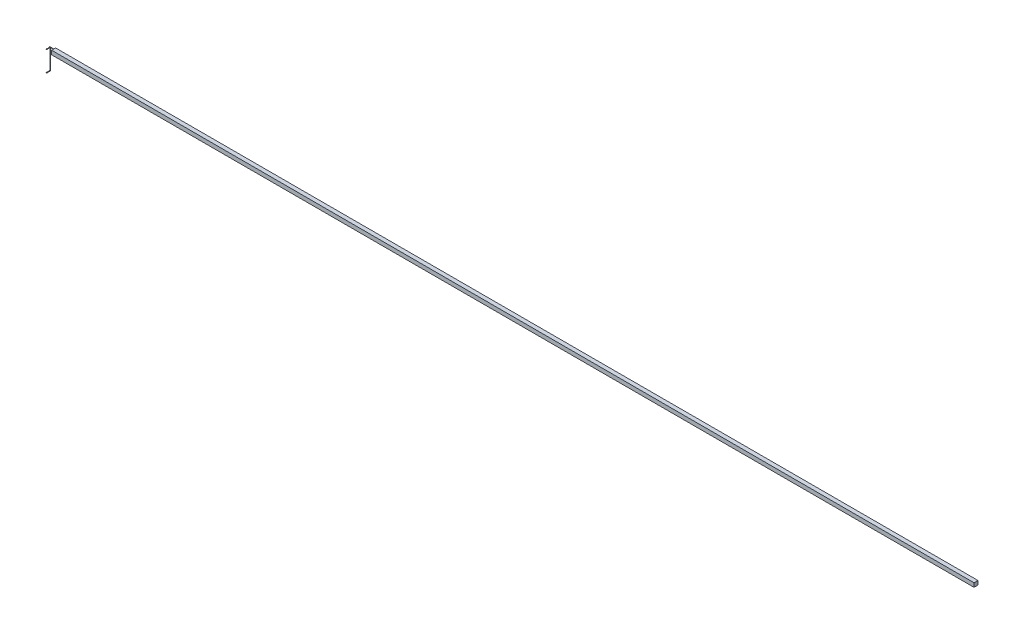
ISO-10303-21;
HEADER;
FILE_DESCRIPTION(('STEP AP214'),'2;1');
FILE_NAME('part.step','',(''),(''),'','','');
FILE_SCHEMA(('AUTOMOTIVE_DESIGN { 1 0 10303 214 1 1 1 1 }'));
ENDSEC;
DATA;
#1=APPLICATION_CONTEXT('core data for automotive mechanical design processes');
#2=APPLICATION_PROTOCOL_DEFINITION('international standard','automotive_design',2000,#1);
#3=PRODUCT_CONTEXT('',#1,'mechanical');
#4=PRODUCT('Part','Part','',(#3));
#5=PRODUCT_RELATED_PRODUCT_CATEGORY('part','',(#4));
#6=PRODUCT_DEFINITION_FORMATION('','',#4);
#7=PRODUCT_DEFINITION_CONTEXT('part definition',#1,'design');
#8=PRODUCT_DEFINITION('design','',#6,#7);
#9=PRODUCT_DEFINITION_SHAPE('','',#8);
#10=(LENGTH_UNIT() NAMED_UNIT(*) SI_UNIT(.MILLI.,.METRE.));
#11=(NAMED_UNIT(*) PLANE_ANGLE_UNIT() SI_UNIT($,.RADIAN.));
#12=(NAMED_UNIT(*) SI_UNIT($,.STERADIAN.) SOLID_ANGLE_UNIT());
#13=UNCERTAINTY_MEASURE_WITH_UNIT(LENGTH_MEASURE(1.E-05),#10,'distance_accuracy_value','');
#14=(GEOMETRIC_REPRESENTATION_CONTEXT(3) GLOBAL_UNCERTAINTY_ASSIGNED_CONTEXT((#13)) GLOBAL_UNIT_ASSIGNED_CONTEXT((#10,
#11,#12)) REPRESENTATION_CONTEXT('',''));
#15=CARTESIAN_POINT('',(0.,0.,0.));
#16=DIRECTION('',(0.,0.,1.));
#17=DIRECTION('',(1.,0.,0.));
#18=AXIS2_PLACEMENT_3D('',#15,#16,#17);
#19=CARTESIAN_POINT('',(112.,86.,0.));
#20=DIRECTION('',(1.,0.,0.));
#21=DIRECTION('',(0.,1.,0.));
#22=AXIS2_PLACEMENT_3D('',#19,#20,#21);
#23=CYLINDRICAL_SURFACE('',#22,1.5);
#24=CARTESIAN_POINT('',(112.,86.,0.));
#25=DIRECTION('',(1.,0.,0.));
#26=DIRECTION('',(0.,0.,-1.));
#27=AXIS2_PLACEMENT_3D('',#24,#25,#26);
#28=CIRCLE('',#27,1.5);
#29=CARTESIAN_POINT('',(112.,87.5,-1.14640854245662E-13));
#30=VERTEX_POINT('',#29);
#31=CARTESIAN_POINT('',(112.,84.5,-1.11022302462516E-13));
#32=VERTEX_POINT('',#31);
#33=EDGE_CURVE('E56',#30,#32,#28,.T.);
#34=ORIENTED_EDGE('',*,*,#33,.F.);
#35=CARTESIAN_POINT('',(112.,86.,0.));
#36=DIRECTION('',(0.707106781186548,0.,0.707106781186548));
#37=DIRECTION('',(-0.707106781186548,0.,0.707106781186548));
#38=AXIS2_PLACEMENT_3D('',#35,#36,#37);
#39=ELLIPSE('',#38,2.12132034355964,1.5);
#40=EDGE_CURVE('E208',#32,#30,#39,.F.);
#41=ORIENTED_EDGE('',*,*,#40,.F.);
#42=EDGE_LOOP('',(#34,#41));
#43=FACE_BOUND('',#42,.T.);
#44=ADVANCED_FACE('F40',(#43),#23,.T.);
#45=CARTESIAN_POINT('',(112.,86.,-15.));
#46=DIRECTION('',(0.,0.,1.));
#47=DIRECTION('',(1.,0.,0.));
#48=AXIS2_PLACEMENT_3D('',#45,#46,#47);
#49=CYLINDRICAL_SURFACE('',#48,1.5);
#50=ORIENTED_EDGE('',*,*,#40,.T.);
#51=DIRECTION('',(0.,0.,1.));
#52=VECTOR('',#51,1.);
#53=CARTESIAN_POINT('',(112.,87.5,-15.));
#54=LINE('',#53,#52);
#55=CARTESIAN_POINT('',(112.,87.5,-15.));
#56=VERTEX_POINT('',#55);
#57=EDGE_CURVE('E152',#30,#56,#54,.F.);
#58=ORIENTED_EDGE('',*,*,#57,.T.);
#59=CARTESIAN_POINT('',(112.,86.,-15.));
#60=DIRECTION('',(0.707106781186548,0.,0.707106781186548));
#61=DIRECTION('',(0.707106781186548,0.,-0.707106781186548));
#62=AXIS2_PLACEMENT_3D('',#59,#60,#61);
#63=ELLIPSE('',#62,2.12132034355964,1.5);
#64=CARTESIAN_POINT('',(112.,84.5,-15.));
#65=VERTEX_POINT('',#64);
#66=EDGE_CURVE('E205',#56,#65,#63,.T.);
#67=ORIENTED_EDGE('',*,*,#66,.T.);
#68=DIRECTION('',(0.,0.,1.));
#69=VECTOR('',#68,1.);
#70=CARTESIAN_POINT('',(112.,84.5,-15.));
#71=LINE('',#70,#69);
#72=EDGE_CURVE('E146',#65,#32,#71,.T.);
#73=ORIENTED_EDGE('',*,*,#72,.T.);
#74=EDGE_LOOP('',(#50,#58,#67,#73));
#75=FACE_BOUND('',#74,.T.);
#76=ADVANCED_FACE('F278',(#75),#49,.T.);
#77=CARTESIAN_POINT('',(71.9999999999997,86.,-19.2426406871193));
#78=DIRECTION('',(0.,0.,1.));
#79=DIRECTION('',(1.,0.,0.));
#80=AXIS2_PLACEMENT_3D('',#77,#78,#79);
#81=CYLINDRICAL_SURFACE('',#80,1.5);
#82=CARTESIAN_POINT('',(71.9999999999998,86.,-11.));
#83=DIRECTION('',(0.,0.,-1.));
#84=DIRECTION('',(-1.,0.,0.));
#85=AXIS2_PLACEMENT_3D('',#82,#83,#84);
#86=CIRCLE('',#85,1.5);
#87=CARTESIAN_POINT('',(70.4999999999998,86.,-11.));
#88=VERTEX_POINT('',#87);
#89=EDGE_CURVE('E48',#88,#88,#86,.F.);
#90=ORIENTED_EDGE('',*,*,#89,.F.);
#91=EDGE_LOOP('',(#90));
#92=FACE_BOUND('',#91,.T.);
#93=CARTESIAN_POINT('',(71.9999999999998,86.,-15.));
#94=DIRECTION('',(0.707106781186545,0.,-0.70710678118655));
#95=DIRECTION('',(0.70710678118655,0.,0.707106781186545));
#96=AXIS2_PLACEMENT_3D('',#93,#94,#95);
#97=ELLIPSE('',#96,2.12132034355965,1.5);
#98=CARTESIAN_POINT('',(72.4354143466934,84.5645856533066,-14.5645856533063));
#99=VERTEX_POINT('',#98);
#100=CARTESIAN_POINT('',(71.9999999999998,87.5,-15.));
#101=VERTEX_POINT('',#100);
#102=EDGE_CURVE('E202',#99,#101,#97,.F.);
#103=ORIENTED_EDGE('',*,*,#102,.T.);
#104=CARTESIAN_POINT('',(71.9999999999998,86.,-15.));
#105=DIRECTION('',(0.70710678118655,0.,0.707106781186545));
#106=DIRECTION('',(-0.707106781186545,0.,0.70710678118655));
#107=AXIS2_PLACEMENT_3D('',#104,#105,#106);
#108=ELLIPSE('',#107,2.12132034355963,1.5);
#109=CARTESIAN_POINT('',(70.5645856533064,85.5645856533063,-13.5645856533066));
#110=VERTEX_POINT('',#109);
#111=EDGE_CURVE('E160',#101,#110,#108,.T.);
#112=ORIENTED_EDGE('',*,*,#111,.T.);
#113=CARTESIAN_POINT('',(71.,84.8819660112499,-13.5));
#114=CARTESIAN_POINT('',(70.9383410889038,84.9371212133062,-13.5000010031375));
#115=CARTESIAN_POINT('',(70.8811841535251,84.997478207983,-13.5038140024479));
#116=CARTESIAN_POINT('',(70.7776460653117,85.1266421729212,-13.515648574613));
#117=CARTESIAN_POINT('',(70.7313051906071,85.1954793138759,-13.5236855270744));
#118=CARTESIAN_POINT('',(70.650747341199,85.3394776110025,-13.5406474353902));
#119=CARTESIAN_POINT('',(70.616485047811,85.4146137901662,-13.5495689074672));
#120=CARTESIAN_POINT('',(70.5607248751387,85.5695829837766,-13.5654672329478));
#121=CARTESIAN_POINT('',(70.5392105500418,85.6494098000981,-13.5724465856319));
#122=CARTESIAN_POINT('',(70.5092698352301,85.8134361743737,-13.5824504520234));
#123=CARTESIAN_POINT('',(70.5011168416737,85.8976915089816,-13.5853921569225));
#124=CARTESIAN_POINT('',(70.4990981303057,86.0663949026319,-13.5861047234806));
#125=CARTESIAN_POINT('',(70.5052315057026,86.1508429491025,-13.5838759133251));
#126=CARTESIAN_POINT('',(70.5308226599426,86.3128850658783,-13.5752069654098));
#127=CARTESIAN_POINT('',(70.5495662860445,86.3906065368669,-13.5689933387882));
#128=CARTESIAN_POINT('',(70.599059330029,86.5419513059894,-13.5543485907704));
#129=CARTESIAN_POINT('',(70.6298181513377,86.615571342536,-13.545915734234));
#130=CARTESIAN_POINT('',(70.7043446613673,86.7604107128016,-13.5289066956695));
#131=CARTESIAN_POINT('',(70.7486610458415,86.8313497457067,-13.5203427436727));
#132=CARTESIAN_POINT('',(70.8486670102947,86.9650821517957,-13.5068041942516));
#133=CARTESIAN_POINT('',(70.9043457039975,87.0278832285202,-13.5018261816513));
#134=CARTESIAN_POINT('',(71.0144463700531,87.1328586918955,-13.4992525798438));
#135=CARTESIAN_POINT('',(71.067243344068,87.1767057929829,-13.5004755260551));
#136=CARTESIAN_POINT('',(71.1779596089969,87.2565404636491,-13.5095620104553));
#137=CARTESIAN_POINT('',(71.235874061114,87.2925353484348,-13.517419334456));
#138=CARTESIAN_POINT('',(71.3550517981144,87.3559567046491,-13.5413552989704));
#139=CARTESIAN_POINT('',(71.4163304724144,87.383339133724,-13.5574751235682));
#140=CARTESIAN_POINT('',(71.5392323210998,87.4289821355658,-13.5987773930534));
#141=CARTESIAN_POINT('',(71.6008554503456,87.4472438764856,-13.6239586766624));
#142=CARTESIAN_POINT('',(71.7166127723875,87.4740871540733,-13.6808034430698));
#143=CARTESIAN_POINT('',(71.7709441722622,87.4833459852188,-13.7117560023681));
#144=CARTESIAN_POINT('',(71.8757611730101,87.4957785324113,-13.7805834330096));
#145=CARTESIAN_POINT('',(71.9262457821064,87.4989506842585,-13.8184600810181));
#146=CARTESIAN_POINT('',(72.0253017678294,87.5006598352292,-13.9030578573165));
#147=CARTESIAN_POINT('',(72.073513886985,87.4988694540297,-13.9502034526277));
#148=CARTESIAN_POINT('',(72.1630749730936,87.4917869482593,-14.0503790619474));
#149=CARTESIAN_POINT('',(72.204419481519,87.4864925598779,-14.1034128616618));
#150=CARTESIAN_POINT('',(72.2857794362514,87.4731941334151,-14.2235567593647));
#151=CARTESIAN_POINT('',(72.3244514268979,87.4648872357454,-14.2915459312266));
#152=CARTESIAN_POINT('',(72.3907984026608,87.4486016845141,-14.4327509812479));
#153=CARTESIAN_POINT('',(72.4184686219756,87.4406231745438,-14.505969108347));
#154=CARTESIAN_POINT('',(72.4639761522302,87.4266571918031,-14.662433493599));
#155=CARTESIAN_POINT('',(72.4807843543017,87.4208950811791,-14.7460042269243));
#156=CARTESIAN_POINT('',(72.4999954650478,87.4142541103406,-14.9149505320181));
#157=CARTESIAN_POINT('',(72.5024064970357,87.4133724964246,-15.0003250587362));
#158=CARTESIAN_POINT('',(72.4929959936689,87.4166760478644,-15.1657546504519));
#159=CARTESIAN_POINT('',(72.4818993729566,87.4206032058387,-15.2458576462784));
#160=CARTESIAN_POINT('',(72.4470839291205,87.4319377700111,-15.4030312670351));
#161=CARTESIAN_POINT('',(72.4233586279893,87.4393469621246,-15.4801003138613));
#162=CARTESIAN_POINT('',(72.3634909285778,87.4556258968165,-15.6305172101941));
#163=CARTESIAN_POINT('',(72.3271564707951,87.4645170547281,-15.7037860774781));
#164=CARTESIAN_POINT('',(72.2429616720443,87.48081234953,-15.8436287770997));
#165=CARTESIAN_POINT('',(72.1950953244377,87.4882157077689,-15.9101990946479));
#166=CARTESIAN_POINT('',(72.087134449031,87.4984796701023,-16.0369614228631));
#167=CARTESIAN_POINT('',(72.0266886869898,87.5011823949405,-16.0968706553187));
#168=CARTESIAN_POINT('',(71.8966628340116,87.4978382975488,-16.2054583944521));
#169=CARTESIAN_POINT('',(71.8271001768709,87.4918079593669,-16.2541578591277));
#170=CARTESIAN_POINT('',(71.6923120249501,87.4694651172681,-16.3326388883716));
#171=CARTESIAN_POINT('',(71.627815337126,87.4546884696547,-16.3641046405804));
#172=CARTESIAN_POINT('',(71.4977444458945,87.4150422369939,-16.416743285502));
#173=CARTESIAN_POINT('',(71.432171014179,87.3901796014266,-16.437923243333));
#174=CARTESIAN_POINT('',(71.3118237572993,87.3342531992104,-16.4683704665197));
#175=CARTESIAN_POINT('',(71.256763387827,87.3044342028141,-16.478837698358));
#176=CARTESIAN_POINT('',(71.150246324653,87.2376873411175,-16.4934245876954));
#177=CARTESIAN_POINT('',(71.0987904007257,87.2007579635809,-16.4975428932233));
#178=CARTESIAN_POINT('',(70.9983624446923,87.118548768478,-16.5008847258836));
#179=CARTESIAN_POINT('',(70.9496563173164,87.0729359694929,-16.4998442182621));
#180=CARTESIAN_POINT('',(70.8588290155896,86.975786430515,-16.4940365638437));
#181=CARTESIAN_POINT('',(70.8167117056983,86.9242462445213,-16.4892672397905));
#182=CARTESIAN_POINT('',(70.7334730565352,86.8073777169641,-16.4768256949438));
#183=CARTESIAN_POINT('',(70.6936334483112,86.7411713536181,-16.4688069840092));
#184=CARTESIAN_POINT('',(70.6245634301353,86.6034222742462,-16.4526899801451));
#185=CARTESIAN_POINT('',(70.5953389237884,86.5318766153429,-16.444591645496));
#186=CARTESIAN_POINT('',(70.5458699472752,86.3777213188603,-16.4298623020312));
#187=CARTESIAN_POINT('',(70.5267818108788,86.2947136601547,-16.4234519576831));
#188=CARTESIAN_POINT('',(70.5029308346639,86.1264668714831,-16.4153052422479));
#189=CARTESIAN_POINT('',(70.4981593099499,86.0412291260293,-16.4135660375715));
#190=CARTESIAN_POINT('',(70.5030011899521,85.8752411589582,-16.4152712221427));
#191=CARTESIAN_POINT('',(70.5119500540225,85.7944680587167,-16.4184761884631));
#192=CARTESIAN_POINT('',(70.5426774532579,85.6356364385152,-16.428675167719));
#193=CARTESIAN_POINT('',(70.5644618613842,85.557579178526,-16.4356709150258));
#194=CARTESIAN_POINT('',(70.6203635181689,85.4056990037749,-16.4514540039866));
#195=CARTESIAN_POINT('',(70.6545528246377,85.3319038111812,-16.4602516799365));
#196=CARTESIAN_POINT('',(70.7344729409976,85.1906614019791,-16.4768745483547));
#197=CARTESIAN_POINT('',(70.780210703168,85.1232180429347,-16.4846991507734));
#198=CARTESIAN_POINT('',(70.8844168586877,84.9936869291277,-16.4964968959187));
#199=CARTESIAN_POINT('',(70.9433417352825,84.9319461621084,-16.5002932152933));
#200=CARTESIAN_POINT('',(71.0708064608412,84.8194114203037,-16.4996734366918));
#201=CARTESIAN_POINT('',(71.1393295392379,84.7685987357409,-16.4952715016906));
#202=CARTESIAN_POINT('',(71.2736715546201,84.6855130603464,-16.4761784861714));
#203=CARTESIAN_POINT('',(71.3387326240586,84.6517065919831,-16.4628620844001));
#204=CARTESIAN_POINT('',(71.470543486476,84.594718161136,-16.4259217790645));
#205=CARTESIAN_POINT('',(71.5372917278801,84.5715267867393,-16.4023070429836));
#206=CARTESIAN_POINT('',(71.6595429460312,84.5379692044558,-16.3486357531833));
#207=CARTESIAN_POINT('',(71.7152974608192,84.5262499575326,-16.3199690439503));
#208=CARTESIAN_POINT('',(71.8234612870885,84.5094193404156,-16.2553409404403));
#209=CARTESIAN_POINT('',(71.8758698707595,84.5043094032616,-16.2193779661316));
#210=CARTESIAN_POINT('',(71.9776481975815,84.499268270207,-16.1395362855101));
#211=CARTESIAN_POINT('',(72.0268365808861,84.4995334078662,-16.0954160888148));
#212=CARTESIAN_POINT('',(72.1188970802296,84.5040083987028,-16.0012066866406));
#213=CARTESIAN_POINT('',(72.1617659009298,84.5082203015609,-15.9511143914591));
#214=CARTESIAN_POINT('',(72.2467669744442,84.5197194832883,-15.8374825715459));
#215=CARTESIAN_POINT('',(72.2876863691432,84.5273907063706,-15.7730734191156));
#216=CARTESIAN_POINT('',(72.3593000225837,84.5432051533681,-15.6388270912977));
#217=CARTESIAN_POINT('',(72.3899875209673,84.55134868519,-15.5689863646197));
#218=CARTESIAN_POINT('',(72.4432496427007,84.5666856335679,-15.4173379233886));
#219=CARTESIAN_POINT('',(72.4645598577671,84.5736758765142,-15.3350590670086));
#220=CARTESIAN_POINT('',(72.4929850475938,84.5832434451466,-15.1678605504071));
#221=CARTESIAN_POINT('',(72.5001088352628,84.5858235103872,-15.0829425629937));
#222=CARTESIAN_POINT('',(72.4998930871178,84.5857499873309,-14.9165942851122));
#223=CARTESIAN_POINT('',(72.4931300559449,84.5833050074606,-14.8351626243685));
#224=CARTESIAN_POINT('',(72.4665568331731,84.5743366283166,-14.674680745163));
#225=CARTESIAN_POINT('',(72.4467415381334,84.5678116338061,-14.5956314708634));
#226=CARTESIAN_POINT('',(72.3948121915711,84.5526419800362,-14.4423017533853));
#227=CARTESIAN_POINT('',(72.3627505375555,84.5440064070618,-14.3680025461527));
#228=CARTESIAN_POINT('',(72.2870674272177,84.5272162698577,-14.2254183565377));
#229=CARTESIAN_POINT('',(72.2434382488335,84.5190620314119,-14.1571374324665));
#230=CARTESIAN_POINT('',(72.1430926931499,84.5059422245843,-14.0250381328922));
#231=CARTESIAN_POINT('',(72.0858341465423,84.5011550479926,-13.9616095682004));
#232=CARTESIAN_POINT('',(71.9612862773896,84.4992150190652,-13.8453792454775));
#233=CARTESIAN_POINT('',(71.894013103837,84.5020499989996,-13.7925606947282));
#234=CARTESIAN_POINT('',(71.7604825760813,84.5179007151504,-13.7048933458791));
#235=CARTESIAN_POINT('',(71.6949835922201,84.5297190837114,-13.6686824707334));
#236=CARTESIAN_POINT('',(71.5616228712863,84.56384562845,-13.6071772579927));
#237=CARTESIAN_POINT('',(71.4937629323676,84.5861459765455,-13.5818748008356));
#238=CARTESIAN_POINT('',(71.3695815533226,84.6375025013965,-13.5450188550212));
#239=CARTESIAN_POINT('',(71.3130597760273,84.6650380876527,-13.5319698322898));
#240=CARTESIAN_POINT('',(71.2031499912196,84.7275941652268,-13.5127759484575));
#241=CARTESIAN_POINT('',(71.1497581321464,84.7626052001701,-13.5066224254945));
#242=CARTESIAN_POINT('',(71.0817538002579,84.8137113942566,-13.5021316870085));
#243=CARTESIAN_POINT('',(71.0650009446656,84.8268713930941,-13.5013182946988));
#244=CARTESIAN_POINT('',(71.0320659770885,84.853894746377,-13.5002524475348));
#245=CARTESIAN_POINT('',(71.0158836128162,84.8677577831335,-13.4999997415873));
#246=CARTESIAN_POINT('',(71.,84.8819660112499,-13.5));
#247=B_SPLINE_CURVE_WITH_KNOTS('',3,(#113,#114,#115,#116,#117,#118,#119,#120,#121,#122,#123,
#124,#125,#126,#127,#128,#129,#130,#131,#132,#133,#134,#135,#136,#137,#138,#139,#140,#141,#142,
#143,#144,#145,#146,#147,#148,#149,#150,#151,#152,#153,#154,#155,#156,#157,#158,#159,#160,#161,
#162,#163,#164,#165,#166,#167,#168,#169,#170,#171,#172,#173,#174,#175,#176,#177,#178,#179,#180,
#181,#182,#183,#184,#185,#186,#187,#188,#189,#190,#191,#192,#193,#194,#195,#196,#197,#198,#199,
#200,#201,#202,#203,#204,#205,#206,#207,#208,#209,#210,#211,#212,#213,#214,#215,#216,#217,#218,
#219,#220,#221,#222,#223,#224,#225,#226,#227,#228,#229,#230,#231,#232,#233,#234,#235,#236,#237,
#238,#239,#240,#241,#242,#243,#244,#245,#246),.UNSPECIFIED.,.T.,.F.,(4,2,2,2,2,2,2,2,2,2,2,2,2,
2,2,2,2,2,2,2,2,2,2,2,2,2,2,2,2,2,2,2,2,2,2,2,2,2,2,2,2,2,2,2,2,2,2,2,2,2,2,2,2,2,2,2,2,2,2,2,2,
2,2,2,2,2,4),(0.,0.248098250340316,0.497106160671044,0.745169596037857,0.992912310697383,
1.24566370871284,1.49839906440563,1.73790713407445,1.97760302619075,2.2286886115958,
2.47953475087677,2.68460276580055,2.8894789135345,3.09538633458765,3.30126737680863,
3.49007135611712,3.6789238491729,3.88052591438121,4.08225835459034,4.31725718907559,
4.5523577108983,4.80733485264303,5.06216811506528,5.30390785811879,5.54577172364808,
5.79149420103044,6.03734494614643,6.29130417804693,6.54478467485286,6.76324082556417,
6.98154670988197,7.17115581364624,7.36080528812357,7.56025846178646,7.75982818323263,
7.99193282421743,8.22416635361335,8.47908953904213,8.73385804895331,8.97667091555345,
9.21959496864977,9.4639533271064,9.70845914381084,9.96330247084802,10.2177059491203,
10.4398680249474,10.6618327365311,10.8522963755807,11.0428013043073,11.2402768800805,
11.4378550680718,11.667012471819,11.8963209844341,12.1508638194392,12.4052484776623,
12.6492861324566,12.8934192627648,13.1365193336601,13.3797820997941,13.6351212271417,
13.8900529826357,14.1159244478103,14.341627496524,14.5333835255241,14.7248984069939,
14.7888382722178,14.8527494973551),.UNSPECIFIED.);
#248=EDGE_CURVE('E12',#99,#110,#247,.T.);
#249=ORIENTED_EDGE('',*,*,#248,.F.);
#250=EDGE_LOOP('',(#103,#112,#249));
#251=FACE_BOUND('',#250,.T.);
#252=ADVANCED_FACE('F237',(#92,#251),#81,.T.);
#253=CARTESIAN_POINT('',(71.,-68.,-15.));
#254=DIRECTION('',(0.,1.,0.));
#255=DIRECTION('',(0.,0.,1.));
#256=AXIS2_PLACEMENT_3D('',#253,#254,#255);
#257=CYLINDRICAL_SURFACE('',#256,1.5);
#258=CARTESIAN_POINT('',(71.,-68.,-15.));
#259=DIRECTION('',(0.,0.707106781186548,-0.707106781186548));
#260=DIRECTION('',(0.,0.707106781186548,0.707106781186548));
#261=AXIS2_PLACEMENT_3D('',#258,#259,#260);
#262=ELLIPSE('',#261,2.12132034355964,1.5);
#263=CARTESIAN_POINT('',(71.,-66.5,-13.5));
#264=VERTEX_POINT('',#263);
#265=EDGE_CURVE('E180',#264,#264,#262,.T.);
#266=ORIENTED_EDGE('',*,*,#265,.T.);
#267=EDGE_LOOP('',(#266));
#268=FACE_BOUND('',#267,.T.);
#269=ORIENTED_EDGE('',*,*,#248,.T.);
#270=CARTESIAN_POINT('',(71.,86.,-15.));
#271=DIRECTION('',(0.707106781186547,-0.707106781186547,0.));
#272=DIRECTION('',(0.707106781186547,0.707106781186547,0.));
#273=AXIS2_PLACEMENT_3D('',#270,#271,#272);
#274=ELLIPSE('',#273,2.12132034355964,1.5);
#275=CARTESIAN_POINT('',(71.,86.,-16.5));
#276=VERTEX_POINT('',#275);
#277=EDGE_CURVE('E185',#276,#110,#274,.F.);
#278=ORIENTED_EDGE('',*,*,#277,.F.);
#279=CARTESIAN_POINT('',(71.,86.,-15.));
#280=DIRECTION('',(0.707106781186547,0.707106781186547,0.));
#281=DIRECTION('',(0.707106781186547,-0.707106781186547,0.));
#282=AXIS2_PLACEMENT_3D('',#279,#280,#281);
#283=ELLIPSE('',#282,2.12132034355964,1.5);
#284=EDGE_CURVE('E64',#99,#276,#283,.T.);
#285=ORIENTED_EDGE('',*,*,#284,.F.);
#286=EDGE_LOOP('',(#269,#278,#285));
#287=FACE_BOUND('',#286,.T.);
#288=ADVANCED_FACE('F231',(#268,#287),#257,.T.);
#289=CARTESIAN_POINT('',(71.,-68.,-19.2426406871193));
#290=DIRECTION('',(0.,0.,1.));
#291=DIRECTION('',(1.,0.,0.));
#292=AXIS2_PLACEMENT_3D('',#289,#290,#291);
#293=CYLINDRICAL_SURFACE('',#292,1.5);
#294=CARTESIAN_POINT('',(71.,-68.,9.));
#295=DIRECTION('',(0.,0.,-1.));
#296=DIRECTION('',(-1.,0.,0.));
#297=AXIS2_PLACEMENT_3D('',#294,#295,#296);
#298=CIRCLE('',#297,1.5);
#299=CARTESIAN_POINT('',(69.5,-68.,9.));
#300=VERTEX_POINT('',#299);
#301=EDGE_CURVE('E43',#300,#300,#298,.T.);
#302=ORIENTED_EDGE('',*,*,#301,.T.);
#303=EDGE_LOOP('',(#302));
#304=FACE_BOUND('',#303,.T.);
#305=CARTESIAN_POINT('',(71.,-68.,-9.));
#306=DIRECTION('',(0.,0.,1.));
#307=DIRECTION('',(1.,0.,0.));
#308=AXIS2_PLACEMENT_3D('',#305,#306,#307);
#309=CIRCLE('',#308,1.5);
#310=CARTESIAN_POINT('',(72.5,-68.,-9.));
#311=VERTEX_POINT('',#310);
#312=EDGE_CURVE('E176',#311,#311,#309,.T.);
#313=ORIENTED_EDGE('',*,*,#312,.T.);
#314=EDGE_LOOP('',(#313));
#315=FACE_BOUND('',#314,.T.);
#316=ADVANCED_FACE('F236',(#304,#315),#293,.T.);
#317=CARTESIAN_POINT('',(71.,-68.,-10.));
#318=DIRECTION('',(0.,0.,-1.));
#319=DIRECTION('',(-1.,0.,0.));
#320=AXIS2_PLACEMENT_3D('',#317,#318,#319);
#321=CIRCLE('',#320,1.5);
#322=CARTESIAN_POINT('',(69.5,-68.,-10.));
#323=VERTEX_POINT('',#322);
#324=EDGE_CURVE('E181',#323,#323,#321,.T.);
#325=ORIENTED_EDGE('',*,*,#324,.T.);
#326=EDGE_LOOP('',(#325));
#327=FACE_BOUND('',#326,.T.);
#328=ORIENTED_EDGE('',*,*,#265,.F.);
#329=EDGE_LOOP('',(#328));
#330=FACE_BOUND('',#329,.T.);
#331=ADVANCED_FACE('F313',(#327,#330),#293,.T.);
#332=CARTESIAN_POINT('',(71.9999999999998,86.,-10.));
#333=DIRECTION('',(0.,0.,1.));
#334=DIRECTION('',(1.,0.,0.));
#335=AXIS2_PLACEMENT_3D('',#332,#333,#334);
#336=CIRCLE('',#335,1.5);
#337=CARTESIAN_POINT('',(73.4999999999998,86.,-10.));
#338=VERTEX_POINT('',#337);
#339=EDGE_CURVE('E217',#338,#338,#336,.F.);
#340=ORIENTED_EDGE('',*,*,#339,.F.);
#341=EDGE_LOOP('',(#340));
#342=FACE_BOUND('',#341,.T.);
#343=CARTESIAN_POINT('',(72.,86.,10.));
#344=DIRECTION('',(0.,0.,-1.));
#345=DIRECTION('',(-1.,0.,0.));
#346=AXIS2_PLACEMENT_3D('',#343,#344,#345);
#347=CIRCLE('',#346,1.5);
#348=CARTESIAN_POINT('',(70.5,86.,10.));
#349=VERTEX_POINT('',#348);
#350=EDGE_CURVE('E211',#349,#349,#347,.F.);
#351=ORIENTED_EDGE('',*,*,#350,.F.);
#352=EDGE_LOOP('',(#351));
#353=FACE_BOUND('',#352,.T.);
#354=ADVANCED_FACE('F227',(#342,#353),#81,.T.);
#355=CARTESIAN_POINT('',(72.,86.,11.));
#356=DIRECTION('',(0.,0.,1.));
#357=DIRECTION('',(1.,0.,0.));
#358=AXIS2_PLACEMENT_3D('',#355,#356,#357);
#359=PLANE('',#358);
#360=CARTESIAN_POINT('',(72.,86.,11.));
#361=DIRECTION('',(0.,0.,1.));
#362=DIRECTION('',(1.,0.,0.));
#363=AXIS2_PLACEMENT_3D('',#360,#361,#362);
#364=CIRCLE('',#363,1.5);
#365=CARTESIAN_POINT('',(73.5,86.,11.));
#366=VERTEX_POINT('',#365);
#367=EDGE_CURVE('E214',#366,#366,#364,.F.);
#368=ORIENTED_EDGE('',*,*,#367,.T.);
#369=EDGE_LOOP('',(#368));
#370=FACE_BOUND('',#369,.T.);
#371=CARTESIAN_POINT('',(72.,86.,11.));
#372=DIRECTION('',(0.,0.,1.));
#373=DIRECTION('',(1.,0.,0.));
#374=AXIS2_PLACEMENT_3D('',#371,#372,#373);
#375=CIRCLE('',#374,3.);
#376=CARTESIAN_POINT('',(75.,86.,11.));
#377=VERTEX_POINT('',#376);
#378=EDGE_CURVE('E196',#377,#377,#375,.T.);
#379=ORIENTED_EDGE('',*,*,#378,.T.);
#380=EDGE_LOOP('',(#379));
#381=FACE_BOUND('',#380,.T.);
#382=ADVANCED_FACE('F263',(#370,#381),#359,.T.);
#383=CARTESIAN_POINT('',(72.,86.,10.));
#384=DIRECTION('',(0.,0.,1.));
#385=DIRECTION('',(1.,0.,0.));
#386=AXIS2_PLACEMENT_3D('',#383,#384,#385);
#387=CYLINDRICAL_SURFACE('',#386,3.);
#388=CARTESIAN_POINT('',(72.,86.,10.));
#389=DIRECTION('',(0.,0.,1.));
#390=DIRECTION('',(1.,0.,0.));
#391=AXIS2_PLACEMENT_3D('',#388,#389,#390);
#392=CIRCLE('',#391,3.);
#393=CARTESIAN_POINT('',(75.,86.,10.));
#394=VERTEX_POINT('',#393);
#395=EDGE_CURVE('E193',#394,#394,#392,.T.);
#396=ORIENTED_EDGE('',*,*,#395,.T.);
#397=EDGE_LOOP('',(#396));
#398=FACE_BOUND('',#397,.T.);
#399=ORIENTED_EDGE('',*,*,#378,.F.);
#400=EDGE_LOOP('',(#399));
#401=FACE_BOUND('',#400,.T.);
#402=ADVANCED_FACE('F259',(#398,#401),#387,.T.);
#403=CARTESIAN_POINT('',(72.,86.,10.));
#404=DIRECTION('',(0.,0.,-1.));
#405=DIRECTION('',(-1.,0.,0.));
#406=AXIS2_PLACEMENT_3D('',#403,#404,#405);
#407=PLANE('',#406);
#408=ORIENTED_EDGE('',*,*,#350,.T.);
#409=EDGE_LOOP('',(#408));
#410=FACE_BOUND('',#409,.T.);
#411=ORIENTED_EDGE('',*,*,#395,.F.);
#412=EDGE_LOOP('',(#411));
#413=FACE_BOUND('',#412,.T.);
#414=ADVANCED_FACE('F255',(#410,#413),#407,.T.);
#415=CARTESIAN_POINT('',(72.,86.,15.));
#416=DIRECTION('',(0.,0.,1.));
#417=DIRECTION('',(1.,0.,0.));
#418=AXIS2_PLACEMENT_3D('',#415,#416,#417);
#419=PLANE('',#418);
#420=CARTESIAN_POINT('',(72.,86.,15.));
#421=DIRECTION('',(0.,0.,1.));
#422=DIRECTION('',(1.,0.,0.));
#423=AXIS2_PLACEMENT_3D('',#420,#421,#422);
#424=CIRCLE('',#423,1.5);
#425=CARTESIAN_POINT('',(73.5,86.,15.));
#426=VERTEX_POINT('',#425);
#427=EDGE_CURVE('E199',#426,#426,#424,.T.);
#428=ORIENTED_EDGE('',*,*,#427,.T.);
#429=EDGE_LOOP('',(#428));
#430=FACE_BOUND('',#429,.T.);
#431=ADVANCED_FACE('F258',(#430),#419,.T.);
#432=ORIENTED_EDGE('',*,*,#367,.F.);
#433=EDGE_LOOP('',(#432));
#434=FACE_BOUND('',#433,.T.);
#435=ORIENTED_EDGE('',*,*,#427,.F.);
#436=EDGE_LOOP('',(#435));
#437=FACE_BOUND('',#436,.T.);
#438=ADVANCED_FACE('F253',(#434,#437),#81,.T.);
#439=CARTESIAN_POINT('',(72.,86.,-11.));
#440=DIRECTION('',(0.,0.,-1.));
#441=DIRECTION('',(-1.,0.,0.));
#442=AXIS2_PLACEMENT_3D('',#439,#440,#441);
#443=PLANE('',#442);
#444=ORIENTED_EDGE('',*,*,#89,.T.);
#445=EDGE_LOOP('',(#444));
#446=FACE_BOUND('',#445,.T.);
#447=CARTESIAN_POINT('',(72.,86.,-11.));
#448=DIRECTION('',(0.,0.,1.));
#449=DIRECTION('',(1.,0.,0.));
#450=AXIS2_PLACEMENT_3D('',#447,#448,#449);
#451=CIRCLE('',#450,3.);
#452=CARTESIAN_POINT('',(75.,86.,-11.));
#453=VERTEX_POINT('',#452);
#454=EDGE_CURVE('E190',#453,#453,#451,.T.);
#455=ORIENTED_EDGE('',*,*,#454,.F.);
#456=EDGE_LOOP('',(#455));
#457=FACE_BOUND('',#456,.T.);
#458=ADVANCED_FACE('F249',(#446,#457),#443,.T.);
#459=CARTESIAN_POINT('',(72.,86.,10.));
#460=DIRECTION('',(0.,0.,1.));
#461=DIRECTION('',(1.,0.,0.));
#462=AXIS2_PLACEMENT_3D('',#459,#460,#461);
#463=CYLINDRICAL_SURFACE('',#462,3.);
#464=ORIENTED_EDGE('',*,*,#454,.T.);
#465=EDGE_LOOP('',(#464));
#466=FACE_BOUND('',#465,.T.);
#467=CARTESIAN_POINT('',(72.,86.,-10.));
#468=DIRECTION('',(0.,0.,1.));
#469=DIRECTION('',(1.,0.,0.));
#470=AXIS2_PLACEMENT_3D('',#467,#468,#469);
#471=CIRCLE('',#470,3.);
#472=CARTESIAN_POINT('',(75.,86.,-10.));
#473=VERTEX_POINT('',#472);
#474=EDGE_CURVE('E187',#473,#473,#471,.T.);
#475=ORIENTED_EDGE('',*,*,#474,.F.);
#476=EDGE_LOOP('',(#475));
#477=FACE_BOUND('',#476,.T.);
#478=ADVANCED_FACE('F245',(#466,#477),#463,.T.);
#479=CARTESIAN_POINT('',(72.,86.,-10.));
#480=DIRECTION('',(0.,0.,1.));
#481=DIRECTION('',(1.,0.,0.));
#482=AXIS2_PLACEMENT_3D('',#479,#480,#481);
#483=PLANE('',#482);
#484=ORIENTED_EDGE('',*,*,#339,.T.);
#485=EDGE_LOOP('',(#484));
#486=FACE_BOUND('',#485,.T.);
#487=ORIENTED_EDGE('',*,*,#474,.T.);
#488=EDGE_LOOP('',(#487));
#489=FACE_BOUND('',#488,.T.);
#490=ADVANCED_FACE('F241',(#486,#489),#483,.T.);
#491=CARTESIAN_POINT('',(112.,86.,-15.));
#492=DIRECTION('',(0.,0.,-1.));
#493=DIRECTION('',(0.,1.,0.));
#494=AXIS2_PLACEMENT_3D('',#491,#492,#493);
#495=CIRCLE('',#494,1.5);
#496=EDGE_CURVE('E155',#65,#56,#495,.F.);
#497=ORIENTED_EDGE('',*,*,#496,.F.);
#498=EDGE_CURVE('E204',#65,#56,#63,.T.);
#499=ORIENTED_EDGE('',*,*,#498,.T.);
#500=EDGE_LOOP('',(#497,#499));
#501=FACE_BOUND('',#500,.T.);
#502=ADVANCED_FACE('F244',(#501),#49,.T.);
#503=CARTESIAN_POINT('',(71.9999999999998,86.,-15.));
#504=DIRECTION('',(1.,0.,0.));
#505=DIRECTION('',(0.,0.,-1.));
#506=AXIS2_PLACEMENT_3D('',#503,#504,#505);
#507=CYLINDRICAL_SURFACE('',#506,1.5);
#508=ORIENTED_EDGE('',*,*,#111,.F.);
#509=ORIENTED_EDGE('',*,*,#102,.F.);
#510=ORIENTED_EDGE('',*,*,#284,.T.);
#511=ORIENTED_EDGE('',*,*,#277,.T.);
#512=EDGE_LOOP('',(#508,#509,#510,#511));
#513=FACE_BOUND('',#512,.T.);
#514=ORIENTED_EDGE('',*,*,#66,.F.);
#515=ORIENTED_EDGE('',*,*,#498,.F.);
#516=EDGE_LOOP('',(#514,#515));
#517=FACE_BOUND('',#516,.T.);
#518=CARTESIAN_POINT('',(68.5,86.,-15.));
#519=DIRECTION('',(1.,0.,0.));
#520=DIRECTION('',(0.,0.,-1.));
#521=AXIS2_PLACEMENT_3D('',#518,#519,#520);
#522=CIRCLE('',#521,1.5);
#523=CARTESIAN_POINT('',(68.5,86.,-16.5));
#524=VERTEX_POINT('',#523);
#525=EDGE_CURVE('E157',#524,#524,#522,.T.);
#526=ORIENTED_EDGE('',*,*,#525,.T.);
#527=EDGE_LOOP('',(#526));
#528=FACE_BOUND('',#527,.T.);
#529=ADVANCED_FACE('F296',(#513,#517,#528),#507,.T.);
#530=CARTESIAN_POINT('',(71.,-68.,-10.));
#531=DIRECTION('',(0.,0.,-1.));
#532=DIRECTION('',(-1.,0.,0.));
#533=AXIS2_PLACEMENT_3D('',#530,#531,#532);
#534=PLANE('',#533);
#535=CARTESIAN_POINT('',(71.,-68.,-10.));
#536=DIRECTION('',(0.,0.,-1.));
#537=DIRECTION('',(-1.,0.,0.));
#538=AXIS2_PLACEMENT_3D('',#535,#536,#537);
#539=CIRCLE('',#538,2.99999999999999);
#540=CARTESIAN_POINT('',(68.,-68.,-10.));
#541=VERTEX_POINT('',#540);
#542=EDGE_CURVE('E173',#541,#541,#539,.T.);
#543=ORIENTED_EDGE('',*,*,#542,.T.);
#544=EDGE_LOOP('',(#543));
#545=FACE_BOUND('',#544,.T.);
#546=ORIENTED_EDGE('',*,*,#324,.F.);
#547=EDGE_LOOP('',(#546));
#548=FACE_BOUND('',#547,.T.);
#549=ADVANCED_FACE('F299',(#545,#548),#534,.T.);
#550=CARTESIAN_POINT('',(71.,-68.,-9.));
#551=DIRECTION('',(0.,0.,1.));
#552=DIRECTION('',(1.,0.,0.));
#553=AXIS2_PLACEMENT_3D('',#550,#551,#552);
#554=PLANE('',#553);
#555=CARTESIAN_POINT('',(71.,-68.,-9.));
#556=DIRECTION('',(0.,0.,-1.));
#557=DIRECTION('',(-1.,0.,0.));
#558=AXIS2_PLACEMENT_3D('',#555,#556,#557);
#559=CIRCLE('',#558,2.99999999999999);
#560=CARTESIAN_POINT('',(68.,-68.,-9.));
#561=VERTEX_POINT('',#560);
#562=EDGE_CURVE('E170',#561,#561,#559,.T.);
#563=ORIENTED_EDGE('',*,*,#562,.F.);
#564=EDGE_LOOP('',(#563));
#565=FACE_BOUND('',#564,.T.);
#566=ORIENTED_EDGE('',*,*,#312,.F.);
#567=EDGE_LOOP('',(#566));
#568=FACE_BOUND('',#567,.T.);
#569=ADVANCED_FACE('F329',(#565,#568),#554,.T.);
#570=CARTESIAN_POINT('',(71.,-68.,-10.));
#571=DIRECTION('',(0.,0.,-1.));
#572=DIRECTION('',(-1.,0.,0.));
#573=AXIS2_PLACEMENT_3D('',#570,#571,#572);
#574=CYLINDRICAL_SURFACE('',#573,2.99999999999999);
#575=ORIENTED_EDGE('',*,*,#562,.T.);
#576=EDGE_LOOP('',(#575));
#577=FACE_BOUND('',#576,.T.);
#578=ORIENTED_EDGE('',*,*,#542,.F.);
#579=EDGE_LOOP('',(#578));
#580=FACE_BOUND('',#579,.T.);
#581=ADVANCED_FACE('F327',(#577,#580),#574,.T.);
#582=CARTESIAN_POINT('',(71.,-65.,9.));
#583=DIRECTION('',(0.,0.,-1.));
#584=DIRECTION('',(-1.,0.,0.));
#585=AXIS2_PLACEMENT_3D('',#582,#583,#584);
#586=PLANE('',#585);
#587=CARTESIAN_POINT('',(71.,-68.,9.));
#588=DIRECTION('',(0.,0.,-1.));
#589=DIRECTION('',(-1.,0.,0.));
#590=AXIS2_PLACEMENT_3D('',#587,#588,#589);
#591=CIRCLE('',#590,2.99999999999999);
#592=CARTESIAN_POINT('',(68.,-68.,9.));
#593=VERTEX_POINT('',#592);
#594=EDGE_CURVE('E163',#593,#593,#591,.T.);
#595=ORIENTED_EDGE('',*,*,#594,.T.);
#596=EDGE_LOOP('',(#595));
#597=FACE_BOUND('',#596,.T.);
#598=ORIENTED_EDGE('',*,*,#301,.F.);
#599=EDGE_LOOP('',(#598));
#600=FACE_BOUND('',#599,.T.);
#601=ADVANCED_FACE('F323',(#597,#600),#586,.T.);
#602=CARTESIAN_POINT('',(71.,-65.,10.));
#603=DIRECTION('',(0.,0.,1.));
#604=DIRECTION('',(1.,0.,0.));
#605=AXIS2_PLACEMENT_3D('',#602,#603,#604);
#606=PLANE('',#605);
#607=CARTESIAN_POINT('',(71.,-68.,10.));
#608=DIRECTION('',(0.,0.,-1.));
#609=DIRECTION('',(-1.,0.,0.));
#610=AXIS2_PLACEMENT_3D('',#607,#608,#609);
#611=CIRCLE('',#610,2.99999999999999);
#612=CARTESIAN_POINT('',(68.,-68.,10.));
#613=VERTEX_POINT('',#612);
#614=EDGE_CURVE('E166',#613,#613,#611,.T.);
#615=ORIENTED_EDGE('',*,*,#614,.F.);
#616=EDGE_LOOP('',(#615));
#617=FACE_BOUND('',#616,.T.);
#618=CARTESIAN_POINT('',(71.,-68.,10.));
#619=DIRECTION('',(0.,0.,1.));
#620=DIRECTION('',(1.,0.,0.));
#621=AXIS2_PLACEMENT_3D('',#618,#619,#620);
#622=CIRCLE('',#621,1.5);
#623=CARTESIAN_POINT('',(72.5,-68.,10.));
#624=VERTEX_POINT('',#623);
#625=EDGE_CURVE('E169',#624,#624,#622,.T.);
#626=ORIENTED_EDGE('',*,*,#625,.F.);
#627=EDGE_LOOP('',(#626));
#628=FACE_BOUND('',#627,.T.);
#629=ADVANCED_FACE('F319',(#617,#628),#606,.T.);
#630=CARTESIAN_POINT('',(71.,-68.,-10.));
#631=DIRECTION('',(0.,0.,-1.));
#632=DIRECTION('',(-1.,0.,0.));
#633=AXIS2_PLACEMENT_3D('',#630,#631,#632);
#634=CYLINDRICAL_SURFACE('',#633,2.99999999999999);
#635=ORIENTED_EDGE('',*,*,#614,.T.);
#636=EDGE_LOOP('',(#635));
#637=FACE_BOUND('',#636,.T.);
#638=ORIENTED_EDGE('',*,*,#594,.F.);
#639=EDGE_LOOP('',(#638));
#640=FACE_BOUND('',#639,.T.);
#641=ADVANCED_FACE('F316',(#637,#640),#634,.T.);
#642=CARTESIAN_POINT('',(71.,-68.,15.));
#643=DIRECTION('',(0.,0.,-1.));
#644=DIRECTION('',(-1.,0.,0.));
#645=AXIS2_PLACEMENT_3D('',#642,#643,#644);
#646=PLANE('',#645);
#647=CARTESIAN_POINT('',(71.,-68.,15.));
#648=DIRECTION('',(0.,0.,-1.));
#649=DIRECTION('',(-1.,0.,0.));
#650=AXIS2_PLACEMENT_3D('',#647,#648,#649);
#651=CIRCLE('',#650,1.5);
#652=CARTESIAN_POINT('',(69.5,-68.,15.));
#653=VERTEX_POINT('',#652);
#654=EDGE_CURVE('E177',#653,#653,#651,.T.);
#655=ORIENTED_EDGE('',*,*,#654,.F.);
#656=EDGE_LOOP('',(#655));
#657=FACE_BOUND('',#656,.T.);
#658=ADVANCED_FACE('F311',(#657),#646,.F.);
#659=ORIENTED_EDGE('',*,*,#625,.T.);
#660=EDGE_LOOP('',(#659));
#661=FACE_BOUND('',#660,.T.);
#662=ORIENTED_EDGE('',*,*,#654,.T.);
#663=EDGE_LOOP('',(#662));
#664=FACE_BOUND('',#663,.T.);
#665=ADVANCED_FACE('F239',(#661,#664),#293,.T.);
#666=CARTESIAN_POINT('',(68.5,86.,-15.));
#667=DIRECTION('',(1.,0.,0.));
#668=DIRECTION('',(0.,0.,-1.));
#669=AXIS2_PLACEMENT_3D('',#666,#667,#668);
#670=PLANE('',#669);
#671=ORIENTED_EDGE('',*,*,#525,.F.);
#672=EDGE_LOOP('',(#671));
#673=FACE_BOUND('',#672,.T.);
#674=ADVANCED_FACE('F302',(#673),#670,.F.);
#675=CARTESIAN_POINT('',(112.,100.999999999999,15.));
#676=DIRECTION('',(0.,0.,1.));
#677=DIRECTION('',(0.,-1.,0.));
#678=AXIS2_PLACEMENT_3D('',#675,#676,#677);
#679=PLANE('',#678);
#680=DIRECTION('',(0.,-1.,0.));
#681=VECTOR('',#680,1.);
#682=CARTESIAN_POINT('',(7072.,101.,15.));
#683=LINE('',#682,#681);
#684=CARTESIAN_POINT('',(7072.,101.,15.));
#685=VERTEX_POINT('',#684);
#686=CARTESIAN_POINT('',(7072.,71.,15.));
#687=VERTEX_POINT('',#686);
#688=EDGE_CURVE('E140',#685,#687,#683,.T.);
#689=ORIENTED_EDGE('',*,*,#688,.F.);
#690=DIRECTION('',(1.,0.,0.));
#691=VECTOR('',#690,1.);
#692=CARTESIAN_POINT('',(112.,100.999999999999,15.));
#693=LINE('',#692,#691);
#694=CARTESIAN_POINT('',(112.,100.999999999999,15.));
#695=VERTEX_POINT('',#694);
#696=EDGE_CURVE('E131',#695,#685,#693,.T.);
#697=ORIENTED_EDGE('',*,*,#696,.F.);
#698=DIRECTION('',(0.,-1.,0.));
#699=VECTOR('',#698,1.);
#700=CARTESIAN_POINT('',(112.,100.999999999999,15.));
#701=LINE('',#700,#699);
#702=CARTESIAN_POINT('',(112.,70.9999999999988,15.));
#703=VERTEX_POINT('',#702);
#704=EDGE_CURVE('E124',#695,#703,#701,.T.);
#705=ORIENTED_EDGE('',*,*,#704,.T.);
#706=DIRECTION('',(1.,0.,0.));
#707=VECTOR('',#706,1.);
#708=CARTESIAN_POINT('',(112.,70.9999999999988,15.));
#709=LINE('',#708,#707);
#710=EDGE_CURVE('E107',#703,#687,#709,.T.);
#711=ORIENTED_EDGE('',*,*,#710,.T.);
#712=EDGE_LOOP('',(#689,#697,#705,#711));
#713=FACE_BOUND('',#712,.T.);
#714=ADVANCED_FACE('F130',(#713),#679,.T.);
#715=CARTESIAN_POINT('',(112.,100.999999999999,15.));
#716=DIRECTION('',(0.,1.,0.));
#717=DIRECTION('',(-1.,0.,0.));
#718=AXIS2_PLACEMENT_3D('',#715,#716,#717);
#719=PLANE('',#718);
#720=DIRECTION('',(0.,0.,1.));
#721=VECTOR('',#720,1.);
#722=CARTESIAN_POINT('',(7072.,101.,15.));
#723=LINE('',#722,#721);
#724=CARTESIAN_POINT('',(7072.,101.,-15.));
#725=VERTEX_POINT('',#724);
#726=EDGE_CURVE('E132',#725,#685,#723,.T.);
#727=ORIENTED_EDGE('',*,*,#726,.F.);
#728=DIRECTION('',(1.,0.,0.));
#729=VECTOR('',#728,1.);
#730=CARTESIAN_POINT('',(112.,100.999999999999,-15.));
#731=LINE('',#730,#729);
#732=CARTESIAN_POINT('',(112.,100.999999999999,-15.));
#733=VERTEX_POINT('',#732);
#734=EDGE_CURVE('E147',#733,#725,#731,.T.);
#735=ORIENTED_EDGE('',*,*,#734,.F.);
#736=DIRECTION('',(0.,0.,1.));
#737=VECTOR('',#736,1.);
#738=CARTESIAN_POINT('',(112.,100.999999999999,15.));
#739=LINE('',#738,#737);
#740=EDGE_CURVE('E118',#733,#695,#739,.T.);
#741=ORIENTED_EDGE('',*,*,#740,.T.);
#742=ORIENTED_EDGE('',*,*,#696,.T.);
#743=EDGE_LOOP('',(#727,#735,#741,#742));
#744=FACE_BOUND('',#743,.T.);
#745=ADVANCED_FACE('F309',(#744),#719,.T.);
#746=CARTESIAN_POINT('',(112.,100.999999999999,-15.));
#747=DIRECTION('',(0.,0.,-1.));
#748=DIRECTION('',(0.,1.,0.));
#749=AXIS2_PLACEMENT_3D('',#746,#747,#748);
#750=PLANE('',#749);
#751=DIRECTION('',(0.,1.,0.));
#752=VECTOR('',#751,1.);
#753=CARTESIAN_POINT('',(112.,100.999999999999,-15.));
#754=LINE('',#753,#752);
#755=CARTESIAN_POINT('',(112.,70.9999999999988,-15.));
#756=VERTEX_POINT('',#755);
#757=EDGE_CURVE('E127',#756,#65,#754,.T.);
#758=ORIENTED_EDGE('',*,*,#757,.T.);
#759=ORIENTED_EDGE('',*,*,#496,.T.);
#760=EDGE_CURVE('E128',#56,#733,#754,.T.);
#761=ORIENTED_EDGE('',*,*,#760,.T.);
#762=ORIENTED_EDGE('',*,*,#734,.T.);
#763=DIRECTION('',(0.,1.,0.));
#764=VECTOR('',#763,1.);
#765=CARTESIAN_POINT('',(7072.,101.,-15.));
#766=LINE('',#765,#764);
#767=CARTESIAN_POINT('',(7072.,71.,-15.));
#768=VERTEX_POINT('',#767);
#769=EDGE_CURVE('E135',#768,#725,#766,.T.);
#770=ORIENTED_EDGE('',*,*,#769,.F.);
#771=DIRECTION('',(1.,0.,0.));
#772=VECTOR('',#771,1.);
#773=CARTESIAN_POINT('',(112.,70.9999999999988,-15.));
#774=LINE('',#773,#772);
#775=EDGE_CURVE('E117',#756,#768,#774,.T.);
#776=ORIENTED_EDGE('',*,*,#775,.F.);
#777=EDGE_LOOP('',(#758,#759,#761,#762,#770,#776));
#778=FACE_BOUND('',#777,.T.);
#779=ADVANCED_FACE('F290',(#778),#750,.T.);
#780=CARTESIAN_POINT('',(112.,70.9999999999988,15.));
#781=DIRECTION('',(0.,-1.,0.));
#782=DIRECTION('',(1.,0.,0.));
#783=AXIS2_PLACEMENT_3D('',#780,#781,#782);
#784=PLANE('',#783);
#785=DIRECTION('',(0.,0.,-1.));
#786=VECTOR('',#785,1.);
#787=CARTESIAN_POINT('',(7072.,71.,15.));
#788=LINE('',#787,#786);
#789=EDGE_CURVE('E112',#687,#768,#788,.T.);
#790=ORIENTED_EDGE('',*,*,#789,.F.);
#791=ORIENTED_EDGE('',*,*,#710,.F.);
#792=DIRECTION('',(0.,0.,-1.));
#793=VECTOR('',#792,1.);
#794=CARTESIAN_POINT('',(112.,70.9999999999988,15.));
#795=LINE('',#794,#793);
#796=EDGE_CURVE('E110',#703,#756,#795,.T.);
#797=ORIENTED_EDGE('',*,*,#796,.T.);
#798=ORIENTED_EDGE('',*,*,#775,.T.);
#799=EDGE_LOOP('',(#790,#791,#797,#798));
#800=FACE_BOUND('',#799,.T.);
#801=ADVANCED_FACE('F109',(#800),#784,.T.);
#802=CARTESIAN_POINT('',(112.,-1.16573417585641E-12,0.));
#803=DIRECTION('',(1.,0.,0.));
#804=DIRECTION('',(0.,0.,-1.));
#805=AXIS2_PLACEMENT_3D('',#802,#803,#804);
#806=PLANE('',#805);
#807=ORIENTED_EDGE('',*,*,#57,.F.);
#808=ORIENTED_EDGE('',*,*,#33,.T.);
#809=ORIENTED_EDGE('',*,*,#72,.F.);
#810=ORIENTED_EDGE('',*,*,#757,.F.);
#811=ORIENTED_EDGE('',*,*,#796,.F.);
#812=ORIENTED_EDGE('',*,*,#704,.F.);
#813=ORIENTED_EDGE('',*,*,#740,.F.);
#814=ORIENTED_EDGE('',*,*,#760,.F.);
#815=EDGE_LOOP('',(#807,#808,#809,#810,#811,#812,#813,#814));
#816=FACE_BOUND('',#815,.T.);
#817=ADVANCED_FACE('F122',(#816),#806,.F.);
#818=CARTESIAN_POINT('',(7072.,86.0000000000012,0.));
#819=DIRECTION('',(1.,0.,0.));
#820=DIRECTION('',(0.,1.,0.));
#821=AXIS2_PLACEMENT_3D('',#818,#819,#820);
#822=PLANE('',#821);
#823=ORIENTED_EDGE('',*,*,#688,.T.);
#824=ORIENTED_EDGE('',*,*,#789,.T.);
#825=ORIENTED_EDGE('',*,*,#769,.T.);
#826=ORIENTED_EDGE('',*,*,#726,.T.);
#827=EDGE_LOOP('',(#823,#824,#825,#826));
#828=FACE_BOUND('',#827,.T.);
#829=ADVANCED_FACE('F268',(#828),#822,.T.);
#830=CLOSED_SHELL('',(#44,#76,#252,#288,#316,#331,#354,#382,#402,#414,#431,#438,#458,#478,#490,
#502,#529,#549,#569,#581,#601,#629,#641,#658,#665,#674,#714,#745,#779,#801,#817,#829));
#831=MANIFOLD_SOLID_BREP('B2',#830);
#832=ADVANCED_BREP_SHAPE_REPRESENTATION('',(#18,#831),#14);
#833=SHAPE_DEFINITION_REPRESENTATION(#9,#832);
ENDSEC;
END-ISO-10303-21;
